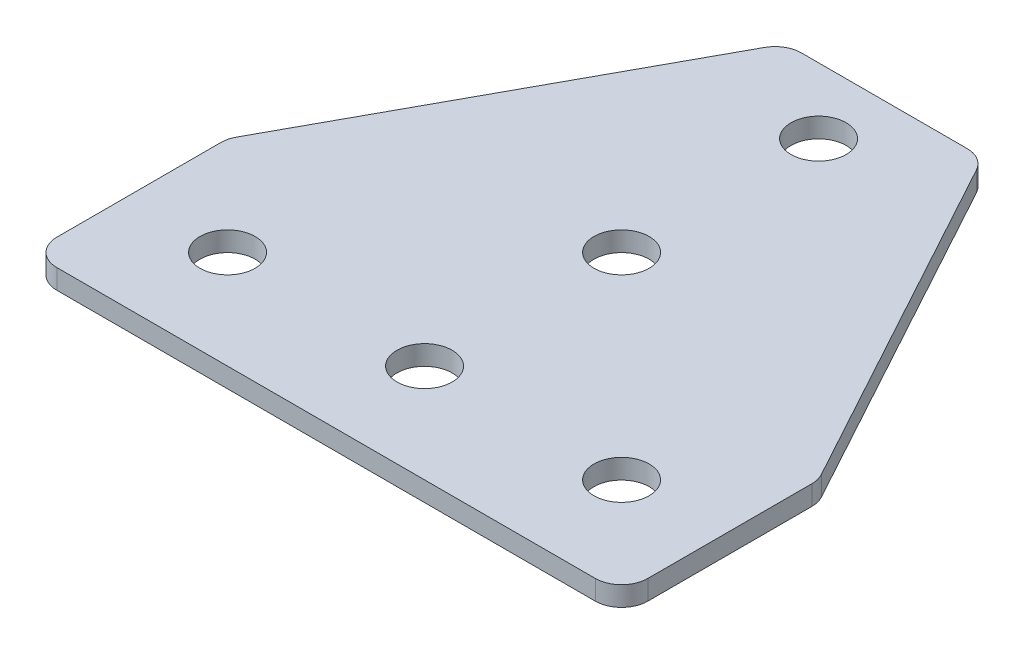
ISO-10303-21;
HEADER;
FILE_DESCRIPTION(('STEP AP214'),'2;1');
FILE_NAME('part.step','',(''),(''),'','','');
FILE_SCHEMA(('AUTOMOTIVE_DESIGN { 1 0 10303 214 1 1 1 1 }'));
ENDSEC;
DATA;
#1=APPLICATION_CONTEXT('core data for automotive mechanical design processes');
#2=APPLICATION_PROTOCOL_DEFINITION('international standard','automotive_design',2000,#1);
#3=PRODUCT_CONTEXT('',#1,'mechanical');
#4=PRODUCT('Part','Part','',(#3));
#5=PRODUCT_RELATED_PRODUCT_CATEGORY('part','',(#4));
#6=PRODUCT_DEFINITION_FORMATION('','',#4);
#7=PRODUCT_DEFINITION_CONTEXT('part definition',#1,'design');
#8=PRODUCT_DEFINITION('design','',#6,#7);
#9=PRODUCT_DEFINITION_SHAPE('','',#8);
#10=(LENGTH_UNIT() NAMED_UNIT(*) SI_UNIT(.MILLI.,.METRE.));
#11=(NAMED_UNIT(*) PLANE_ANGLE_UNIT() SI_UNIT($,.RADIAN.));
#12=(NAMED_UNIT(*) SI_UNIT($,.STERADIAN.) SOLID_ANGLE_UNIT());
#13=UNCERTAINTY_MEASURE_WITH_UNIT(LENGTH_MEASURE(1.E-05),#10,'distance_accuracy_value','');
#14=(GEOMETRIC_REPRESENTATION_CONTEXT(3) GLOBAL_UNCERTAINTY_ASSIGNED_CONTEXT((#13)) GLOBAL_UNIT_ASSIGNED_CONTEXT((#10,
#11,#12)) REPRESENTATION_CONTEXT('',''));
#15=CARTESIAN_POINT('',(0.,0.,0.));
#16=DIRECTION('',(0.,0.,1.));
#17=DIRECTION('',(1.,0.,0.));
#18=AXIS2_PLACEMENT_3D('',#15,#16,#17);
#19=CARTESIAN_POINT('',(0.,1.5,0.));
#20=DIRECTION('',(0.,1.,0.));
#21=DIRECTION('',(0.,0.,1.));
#22=AXIS2_PLACEMENT_3D('',#19,#20,#21);
#23=PLANE('',#22);
#24=CARTESIAN_POINT('',(22.5,1.5,-37.5));
#25=DIRECTION('',(0.,1.,0.));
#26=DIRECTION('',(0.,0.,1.));
#27=AXIS2_PLACEMENT_3D('',#24,#25,#26);
#28=CIRCLE('',#27,2.1);
#29=CARTESIAN_POINT('',(22.5,1.5,-35.4));
#30=VERTEX_POINT('',#29);
#31=EDGE_CURVE('E498',#30,#30,#28,.T.);
#32=ORIENTED_EDGE('',*,*,#31,.F.);
#33=EDGE_LOOP('',(#32));
#34=FACE_BOUND('',#33,.T.);
#35=CARTESIAN_POINT('',(37.5,1.5,-7.5));
#36=DIRECTION('',(0.,1.,0.));
#37=DIRECTION('',(0.,0.,-1.));
#38=AXIS2_PLACEMENT_3D('',#35,#36,#37);
#39=CIRCLE('',#38,2.1);
#40=CARTESIAN_POINT('',(37.5,1.5,-9.6));
#41=VERTEX_POINT('',#40);
#42=EDGE_CURVE('E210',#41,#41,#39,.T.);
#43=ORIENTED_EDGE('',*,*,#42,.F.);
#44=EDGE_LOOP('',(#43));
#45=FACE_BOUND('',#44,.T.);
#46=DIRECTION('',(-0.478852130680573,0.,0.877895572914384));
#47=VECTOR('',#46,1.);
#48=CARTESIAN_POINT('',(15.,1.5,-42.5));
#49=LINE('',#48,#47);
#50=CARTESIAN_POINT('',(14.4314750516515,1.5,-41.4577042613612));
#51=VERTEX_POINT('',#50);
#52=CARTESIAN_POINT('',(0.244208854171231,1.5,-15.4477162326473));
#53=VERTEX_POINT('',#52);
#54=EDGE_CURVE('E167',#51,#53,#49,.T.);
#55=ORIENTED_EDGE('',*,*,#54,.T.);
#56=CARTESIAN_POINT('',(2.,1.5,-14.4900119712861));
#57=DIRECTION('',(0.,1.,0.));
#58=DIRECTION('',(0.,0.,1.));
#59=AXIS2_PLACEMENT_3D('',#56,#57,#58);
#60=CIRCLE('',#59,2.);
#61=CARTESIAN_POINT('',(0.,1.5,-14.4900119712861));
#62=VERTEX_POINT('',#61);
#63=EDGE_CURVE('E229',#53,#62,#60,.T.);
#64=ORIENTED_EDGE('',*,*,#63,.T.);
#65=DIRECTION('',(0.,0.,1.));
#66=VECTOR('',#65,1.);
#67=CARTESIAN_POINT('',(0.,1.5,-15.));
#68=LINE('',#67,#66);
#69=CARTESIAN_POINT('',(0.,1.5,-2.));
#70=VERTEX_POINT('',#69);
#71=EDGE_CURVE('E149',#62,#70,#68,.T.);
#72=ORIENTED_EDGE('',*,*,#71,.T.);
#73=CARTESIAN_POINT('',(2.,1.5,-2.));
#74=DIRECTION('',(0.,1.,0.));
#75=DIRECTION('',(0.,0.,1.));
#76=AXIS2_PLACEMENT_3D('',#73,#74,#75);
#77=CIRCLE('',#76,2.);
#78=CARTESIAN_POINT('',(2.,1.5,0.));
#79=VERTEX_POINT('',#78);
#80=EDGE_CURVE('E225',#70,#79,#77,.T.);
#81=ORIENTED_EDGE('',*,*,#80,.T.);
#82=DIRECTION('',(1.,0.,0.));
#83=VECTOR('',#82,1.);
#84=CARTESIAN_POINT('',(0.,1.5,0.));
#85=LINE('',#84,#83);
#86=CARTESIAN_POINT('',(43.,1.5,0.));
#87=VERTEX_POINT('',#86);
#88=EDGE_CURVE('E214',#79,#87,#85,.T.);
#89=ORIENTED_EDGE('',*,*,#88,.T.);
#90=CARTESIAN_POINT('',(43.,1.5,-2.));
#91=DIRECTION('',(0.,1.,0.));
#92=DIRECTION('',(0.,0.,1.));
#93=AXIS2_PLACEMENT_3D('',#90,#91,#92);
#94=CIRCLE('',#93,2.);
#95=CARTESIAN_POINT('',(45.,1.5,-2.));
#96=VERTEX_POINT('',#95);
#97=EDGE_CURVE('E230',#87,#96,#94,.T.);
#98=ORIENTED_EDGE('',*,*,#97,.T.);
#99=DIRECTION('',(0.,0.,-1.));
#100=VECTOR('',#99,1.);
#101=CARTESIAN_POINT('',(45.,1.5,0.));
#102=LINE('',#101,#100);
#103=CARTESIAN_POINT('',(45.,1.5,-14.4900119712861));
#104=VERTEX_POINT('',#103);
#105=EDGE_CURVE('E271',#96,#104,#102,.T.);
#106=ORIENTED_EDGE('',*,*,#105,.T.);
#107=CARTESIAN_POINT('',(43.,1.5,-14.4900119712861));
#108=DIRECTION('',(0.,1.,0.));
#109=DIRECTION('',(0.,0.,1.));
#110=AXIS2_PLACEMENT_3D('',#107,#108,#109);
#111=CIRCLE('',#110,2.);
#112=CARTESIAN_POINT('',(44.7557911458288,1.5,-15.4477162326473));
#113=VERTEX_POINT('',#112);
#114=EDGE_CURVE('E279',#104,#113,#111,.T.);
#115=ORIENTED_EDGE('',*,*,#114,.T.);
#116=DIRECTION('',(-0.478852130680573,0.,-0.877895572914384));
#117=VECTOR('',#116,1.);
#118=CARTESIAN_POINT('',(45.,1.5,-15.));
#119=LINE('',#118,#117);
#120=CARTESIAN_POINT('',(30.5685249483485,1.5,-41.4577042613611));
#121=VERTEX_POINT('',#120);
#122=EDGE_CURVE('E255',#113,#121,#119,.T.);
#123=ORIENTED_EDGE('',*,*,#122,.T.);
#124=CARTESIAN_POINT('',(28.8127338025197,1.5,-40.5));
#125=DIRECTION('',(0.,1.,0.));
#126=DIRECTION('',(0.,0.,1.));
#127=AXIS2_PLACEMENT_3D('',#124,#125,#126);
#128=CIRCLE('',#127,2.);
#129=CARTESIAN_POINT('',(28.8127338025197,1.5,-42.5));
#130=VERTEX_POINT('',#129);
#131=EDGE_CURVE('E60',#121,#130,#128,.T.);
#132=ORIENTED_EDGE('',*,*,#131,.T.);
#133=DIRECTION('',(-1.,0.,0.));
#134=VECTOR('',#133,1.);
#135=CARTESIAN_POINT('',(30.,1.5,-42.5));
#136=LINE('',#135,#134);
#137=CARTESIAN_POINT('',(16.1872661974803,1.5,-42.5));
#138=VERTEX_POINT('',#137);
#139=EDGE_CURVE('E264',#130,#138,#136,.T.);
#140=ORIENTED_EDGE('',*,*,#139,.T.);
#141=CARTESIAN_POINT('',(16.1872661974803,1.5,-40.5));
#142=DIRECTION('',(0.,1.,0.));
#143=DIRECTION('',(0.,0.,1.));
#144=AXIS2_PLACEMENT_3D('',#141,#142,#143);
#145=CIRCLE('',#144,2.);
#146=EDGE_CURVE('E192',#138,#51,#145,.T.);
#147=ORIENTED_EDGE('',*,*,#146,.T.);
#148=EDGE_LOOP('',(#55,#64,#72,#81,#89,#98,#106,#115,#123,#132,#140,#147));
#149=FACE_BOUND('',#148,.T.);
#150=CARTESIAN_POINT('',(7.5,1.5,-7.5));
#151=DIRECTION('',(0.,1.,0.));
#152=DIRECTION('',(0.,0.,1.));
#153=AXIS2_PLACEMENT_3D('',#150,#151,#152);
#154=CIRCLE('',#153,2.1);
#155=CARTESIAN_POINT('',(7.5,1.5,-5.4));
#156=VERTEX_POINT('',#155);
#157=EDGE_CURVE('E157',#156,#156,#154,.T.);
#158=ORIENTED_EDGE('',*,*,#157,.F.);
#159=EDGE_LOOP('',(#158));
#160=FACE_BOUND('',#159,.T.);
#161=CARTESIAN_POINT('',(22.5,1.5,-7.5));
#162=DIRECTION('',(0.,1.,0.));
#163=DIRECTION('',(0.,0.,1.));
#164=AXIS2_PLACEMENT_3D('',#161,#162,#163);
#165=CIRCLE('',#164,2.1);
#166=CARTESIAN_POINT('',(22.5,1.5,-5.4));
#167=VERTEX_POINT('',#166);
#168=EDGE_CURVE('E509',#167,#167,#165,.T.);
#169=ORIENTED_EDGE('',*,*,#168,.F.);
#170=EDGE_LOOP('',(#169));
#171=FACE_BOUND('',#170,.T.);
#172=CARTESIAN_POINT('',(22.5,1.5,-22.5));
#173=DIRECTION('',(0.,1.,0.));
#174=DIRECTION('',(0.,0.,1.));
#175=AXIS2_PLACEMENT_3D('',#172,#173,#174);
#176=CIRCLE('',#175,2.1);
#177=CARTESIAN_POINT('',(22.5,1.5,-20.4));
#178=VERTEX_POINT('',#177);
#179=EDGE_CURVE('E492',#178,#178,#176,.T.);
#180=ORIENTED_EDGE('',*,*,#179,.F.);
#181=EDGE_LOOP('',(#180));
#182=FACE_BOUND('',#181,.T.);
#183=ADVANCED_FACE('F39',(#34,#45,#149,#160,#171,#182),#23,.T.);
#184=CARTESIAN_POINT('',(0.,0.,0.));
#185=DIRECTION('',(0.,1.,0.));
#186=DIRECTION('',(0.,0.,1.));
#187=AXIS2_PLACEMENT_3D('',#184,#185,#186);
#188=PLANE('',#187);
#189=DIRECTION('',(0.,0.,1.));
#190=VECTOR('',#189,1.);
#191=CARTESIAN_POINT('',(0.,0.,-15.));
#192=LINE('',#191,#190);
#193=CARTESIAN_POINT('',(0.,0.,-14.4900119712861));
#194=VERTEX_POINT('',#193);
#195=CARTESIAN_POINT('',(0.,0.,-2.));
#196=VERTEX_POINT('',#195);
#197=EDGE_CURVE('E146',#194,#196,#192,.T.);
#198=ORIENTED_EDGE('',*,*,#197,.F.);
#199=CARTESIAN_POINT('',(2.,0.,-14.4900119712861));
#200=DIRECTION('',(0.,1.,0.));
#201=DIRECTION('',(0.,0.,1.));
#202=AXIS2_PLACEMENT_3D('',#199,#200,#201);
#203=CIRCLE('',#202,2.);
#204=CARTESIAN_POINT('',(0.244208854171231,0.,-15.4477162326473));
#205=VERTEX_POINT('',#204);
#206=EDGE_CURVE('E129',#194,#205,#203,.F.);
#207=ORIENTED_EDGE('',*,*,#206,.T.);
#208=DIRECTION('',(-0.478852130680573,0.,0.877895572914384));
#209=VECTOR('',#208,1.);
#210=CARTESIAN_POINT('',(15.,0.,-42.5));
#211=LINE('',#210,#209);
#212=CARTESIAN_POINT('',(14.4314750516515,0.,-41.4577042613612));
#213=VERTEX_POINT('',#212);
#214=EDGE_CURVE('E178',#213,#205,#211,.T.);
#215=ORIENTED_EDGE('',*,*,#214,.F.);
#216=CARTESIAN_POINT('',(16.1872661974803,0.,-40.5));
#217=DIRECTION('',(0.,1.,0.));
#218=DIRECTION('',(0.,0.,1.));
#219=AXIS2_PLACEMENT_3D('',#216,#217,#218);
#220=CIRCLE('',#219,2.);
#221=CARTESIAN_POINT('',(16.1872661974803,0.,-42.5));
#222=VERTEX_POINT('',#221);
#223=EDGE_CURVE('E150',#213,#222,#220,.F.);
#224=ORIENTED_EDGE('',*,*,#223,.T.);
#225=DIRECTION('',(-1.,0.,0.));
#226=VECTOR('',#225,1.);
#227=CARTESIAN_POINT('',(30.,0.,-42.5));
#228=LINE('',#227,#226);
#229=CARTESIAN_POINT('',(28.8127338025197,0.,-42.5));
#230=VERTEX_POINT('',#229);
#231=EDGE_CURVE('E176',#230,#222,#228,.T.);
#232=ORIENTED_EDGE('',*,*,#231,.F.);
#233=CARTESIAN_POINT('',(28.8127338025197,0.,-40.5));
#234=DIRECTION('',(0.,1.,0.));
#235=DIRECTION('',(0.,0.,1.));
#236=AXIS2_PLACEMENT_3D('',#233,#234,#235);
#237=CIRCLE('',#236,2.);
#238=CARTESIAN_POINT('',(30.5685249483485,0.,-41.4577042613611));
#239=VERTEX_POINT('',#238);
#240=EDGE_CURVE('E182',#230,#239,#237,.F.);
#241=ORIENTED_EDGE('',*,*,#240,.T.);
#242=DIRECTION('',(-0.478852130680573,0.,-0.877895572914384));
#243=VECTOR('',#242,1.);
#244=CARTESIAN_POINT('',(45.,0.,-15.));
#245=LINE('',#244,#243);
#246=CARTESIAN_POINT('',(44.7557911458288,0.,-15.4477162326473));
#247=VERTEX_POINT('',#246);
#248=EDGE_CURVE('E173',#247,#239,#245,.T.);
#249=ORIENTED_EDGE('',*,*,#248,.F.);
#250=CARTESIAN_POINT('',(43.,0.,-14.4900119712861));
#251=DIRECTION('',(0.,1.,0.));
#252=DIRECTION('',(0.,0.,1.));
#253=AXIS2_PLACEMENT_3D('',#250,#251,#252);
#254=CIRCLE('',#253,2.);
#255=CARTESIAN_POINT('',(45.,0.,-14.4900119712861));
#256=VERTEX_POINT('',#255);
#257=EDGE_CURVE('E184',#247,#256,#254,.F.);
#258=ORIENTED_EDGE('',*,*,#257,.T.);
#259=DIRECTION('',(0.,0.,-1.));
#260=VECTOR('',#259,1.);
#261=CARTESIAN_POINT('',(45.,0.,0.));
#262=LINE('',#261,#260);
#263=CARTESIAN_POINT('',(45.,0.,-2.));
#264=VERTEX_POINT('',#263);
#265=EDGE_CURVE('E160',#264,#256,#262,.T.);
#266=ORIENTED_EDGE('',*,*,#265,.F.);
#267=CARTESIAN_POINT('',(43.,0.,-2.));
#268=DIRECTION('',(0.,1.,0.));
#269=DIRECTION('',(0.,0.,1.));
#270=AXIS2_PLACEMENT_3D('',#267,#268,#269);
#271=CIRCLE('',#270,2.);
#272=CARTESIAN_POINT('',(43.,0.,0.));
#273=VERTEX_POINT('',#272);
#274=EDGE_CURVE('E186',#264,#273,#271,.F.);
#275=ORIENTED_EDGE('',*,*,#274,.T.);
#276=DIRECTION('',(1.,0.,0.));
#277=VECTOR('',#276,1.);
#278=CARTESIAN_POINT('',(0.,0.,0.));
#279=LINE('',#278,#277);
#280=CARTESIAN_POINT('',(2.,0.,0.));
#281=VERTEX_POINT('',#280);
#282=EDGE_CURVE('E156',#281,#273,#279,.T.);
#283=ORIENTED_EDGE('',*,*,#282,.F.);
#284=CARTESIAN_POINT('',(2.,0.,-2.));
#285=DIRECTION('',(0.,1.,0.));
#286=DIRECTION('',(0.,0.,1.));
#287=AXIS2_PLACEMENT_3D('',#284,#285,#286);
#288=CIRCLE('',#287,2.);
#289=EDGE_CURVE('E140',#281,#196,#288,.F.);
#290=ORIENTED_EDGE('',*,*,#289,.T.);
#291=EDGE_LOOP('',(#198,#207,#215,#224,#232,#241,#249,#258,#266,#275,#283,#290));
#292=FACE_BOUND('',#291,.T.);
#293=CARTESIAN_POINT('',(7.5,0.,-7.5));
#294=DIRECTION('',(0.,1.,0.));
#295=DIRECTION('',(0.,0.,1.));
#296=AXIS2_PLACEMENT_3D('',#293,#294,#295);
#297=CIRCLE('',#296,2.1);
#298=CARTESIAN_POINT('',(7.5,0.,-5.4));
#299=VERTEX_POINT('',#298);
#300=EDGE_CURVE('E164',#299,#299,#297,.T.);
#301=ORIENTED_EDGE('',*,*,#300,.T.);
#302=EDGE_LOOP('',(#301));
#303=FACE_BOUND('',#302,.T.);
#304=CARTESIAN_POINT('',(37.5,0.,-7.5));
#305=DIRECTION('',(0.,1.,0.));
#306=DIRECTION('',(0.,0.,-1.));
#307=AXIS2_PLACEMENT_3D('',#304,#305,#306);
#308=CIRCLE('',#307,2.1);
#309=CARTESIAN_POINT('',(37.5,0.,-9.6));
#310=VERTEX_POINT('',#309);
#311=EDGE_CURVE('E206',#310,#310,#308,.T.);
#312=ORIENTED_EDGE('',*,*,#311,.T.);
#313=EDGE_LOOP('',(#312));
#314=FACE_BOUND('',#313,.T.);
#315=CARTESIAN_POINT('',(22.5,0.,-7.5));
#316=DIRECTION('',(0.,1.,0.));
#317=DIRECTION('',(0.,0.,1.));
#318=AXIS2_PLACEMENT_3D('',#315,#316,#317);
#319=CIRCLE('',#318,2.1);
#320=CARTESIAN_POINT('',(22.5,0.,-5.4));
#321=VERTEX_POINT('',#320);
#322=EDGE_CURVE('E483',#321,#321,#319,.T.);
#323=ORIENTED_EDGE('',*,*,#322,.T.);
#324=EDGE_LOOP('',(#323));
#325=FACE_BOUND('',#324,.T.);
#326=CARTESIAN_POINT('',(22.5,0.,-37.5));
#327=DIRECTION('',(0.,1.,0.));
#328=DIRECTION('',(0.,0.,1.));
#329=AXIS2_PLACEMENT_3D('',#326,#327,#328);
#330=CIRCLE('',#329,2.1);
#331=CARTESIAN_POINT('',(22.5,0.,-35.4));
#332=VERTEX_POINT('',#331);
#333=EDGE_CURVE('E487',#332,#332,#330,.T.);
#334=ORIENTED_EDGE('',*,*,#333,.T.);
#335=EDGE_LOOP('',(#334));
#336=FACE_BOUND('',#335,.T.);
#337=CARTESIAN_POINT('',(22.5,0.,-22.5));
#338=DIRECTION('',(0.,1.,0.));
#339=DIRECTION('',(0.,0.,1.));
#340=AXIS2_PLACEMENT_3D('',#337,#338,#339);
#341=CIRCLE('',#340,2.1);
#342=CARTESIAN_POINT('',(22.5,0.,-20.4));
#343=VERTEX_POINT('',#342);
#344=EDGE_CURVE('E490',#343,#343,#341,.T.);
#345=ORIENTED_EDGE('',*,*,#344,.T.);
#346=EDGE_LOOP('',(#345));
#347=FACE_BOUND('',#346,.T.);
#348=ADVANCED_FACE('F153',(#292,#303,#314,#325,#336,#347),#188,.F.);
#349=CARTESIAN_POINT('',(0.,1.5,-15.));
#350=DIRECTION('',(1.,0.,0.));
#351=DIRECTION('',(0.,0.,-1.));
#352=AXIS2_PLACEMENT_3D('',#349,#350,#351);
#353=PLANE('',#352);
#354=ORIENTED_EDGE('',*,*,#71,.F.);
#355=DIRECTION('',(0.,-1.,0.));
#356=VECTOR('',#355,1.);
#357=CARTESIAN_POINT('',(0.,1.5,-14.4900119712861));
#358=LINE('',#357,#356);
#359=EDGE_CURVE('E133',#62,#194,#358,.T.);
#360=ORIENTED_EDGE('',*,*,#359,.T.);
#361=ORIENTED_EDGE('',*,*,#197,.T.);
#362=DIRECTION('',(0.,-1.,0.));
#363=VECTOR('',#362,1.);
#364=CARTESIAN_POINT('',(0.,1.5,-2.));
#365=LINE('',#364,#363);
#366=EDGE_CURVE('E151',#196,#70,#365,.F.);
#367=ORIENTED_EDGE('',*,*,#366,.T.);
#368=EDGE_LOOP('',(#354,#360,#361,#367));
#369=FACE_BOUND('',#368,.T.);
#370=ADVANCED_FACE('F145',(#369),#353,.F.);
#371=CARTESIAN_POINT('',(0.,1.5,0.));
#372=DIRECTION('',(0.,0.,-1.));
#373=DIRECTION('',(-1.,0.,0.));
#374=AXIS2_PLACEMENT_3D('',#371,#372,#373);
#375=PLANE('',#374);
#376=ORIENTED_EDGE('',*,*,#88,.F.);
#377=DIRECTION('',(0.,-1.,0.));
#378=VECTOR('',#377,1.);
#379=CARTESIAN_POINT('',(2.,1.5,0.));
#380=LINE('',#379,#378);
#381=EDGE_CURVE('E237',#79,#281,#380,.T.);
#382=ORIENTED_EDGE('',*,*,#381,.T.);
#383=ORIENTED_EDGE('',*,*,#282,.T.);
#384=DIRECTION('',(0.,-1.,0.));
#385=VECTOR('',#384,1.);
#386=CARTESIAN_POINT('',(43.,1.5,0.));
#387=LINE('',#386,#385);
#388=EDGE_CURVE('E235',#273,#87,#387,.F.);
#389=ORIENTED_EDGE('',*,*,#388,.T.);
#390=EDGE_LOOP('',(#376,#382,#383,#389));
#391=FACE_BOUND('',#390,.T.);
#392=ADVANCED_FACE('F299',(#391),#375,.F.);
#393=CARTESIAN_POINT('',(45.,1.5,0.));
#394=DIRECTION('',(-1.,0.,0.));
#395=DIRECTION('',(0.,0.,1.));
#396=AXIS2_PLACEMENT_3D('',#393,#394,#395);
#397=PLANE('',#396);
#398=ORIENTED_EDGE('',*,*,#105,.F.);
#399=DIRECTION('',(0.,-1.,0.));
#400=VECTOR('',#399,1.);
#401=CARTESIAN_POINT('',(45.,1.5,-2.));
#402=LINE('',#401,#400);
#403=EDGE_CURVE('E242',#96,#264,#402,.T.);
#404=ORIENTED_EDGE('',*,*,#403,.T.);
#405=ORIENTED_EDGE('',*,*,#265,.T.);
#406=DIRECTION('',(0.,-1.,0.));
#407=VECTOR('',#406,1.);
#408=CARTESIAN_POINT('',(45.,1.5,-14.4900119712861));
#409=LINE('',#408,#407);
#410=EDGE_CURVE('E240',#256,#104,#409,.F.);
#411=ORIENTED_EDGE('',*,*,#410,.T.);
#412=EDGE_LOOP('',(#398,#404,#405,#411));
#413=FACE_BOUND('',#412,.T.);
#414=ADVANCED_FACE('F295',(#413),#397,.F.);
#415=CARTESIAN_POINT('',(45.,1.5,-15.));
#416=DIRECTION('',(-0.877895572914384,0.,0.478852130680573));
#417=DIRECTION('',(0.478852130680573,0.,0.877895572914385));
#418=AXIS2_PLACEMENT_3D('',#415,#416,#417);
#419=PLANE('',#418);
#420=ORIENTED_EDGE('',*,*,#122,.F.);
#421=DIRECTION('',(0.,-1.,0.));
#422=VECTOR('',#421,1.);
#423=CARTESIAN_POINT('',(44.7557911458288,1.5,-15.4477162326473));
#424=LINE('',#423,#422);
#425=EDGE_CURVE('E247',#113,#247,#424,.T.);
#426=ORIENTED_EDGE('',*,*,#425,.T.);
#427=ORIENTED_EDGE('',*,*,#248,.T.);
#428=DIRECTION('',(0.,-1.,0.));
#429=VECTOR('',#428,1.);
#430=CARTESIAN_POINT('',(30.5685249483485,1.5,-41.4577042613612));
#431=LINE('',#430,#429);
#432=EDGE_CURVE('E245',#239,#121,#431,.F.);
#433=ORIENTED_EDGE('',*,*,#432,.T.);
#434=EDGE_LOOP('',(#420,#426,#427,#433));
#435=FACE_BOUND('',#434,.T.);
#436=ADVANCED_FACE('F253',(#435),#419,.F.);
#437=CARTESIAN_POINT('',(30.,1.5,-42.5));
#438=DIRECTION('',(0.,0.,1.));
#439=DIRECTION('',(1.,0.,0.));
#440=AXIS2_PLACEMENT_3D('',#437,#438,#439);
#441=PLANE('',#440);
#442=ORIENTED_EDGE('',*,*,#139,.F.);
#443=DIRECTION('',(0.,-1.,0.));
#444=VECTOR('',#443,1.);
#445=CARTESIAN_POINT('',(28.8127338025197,1.5,-42.5));
#446=LINE('',#445,#444);
#447=EDGE_CURVE('E12',#130,#230,#446,.T.);
#448=ORIENTED_EDGE('',*,*,#447,.T.);
#449=ORIENTED_EDGE('',*,*,#231,.T.);
#450=DIRECTION('',(0.,-1.,0.));
#451=VECTOR('',#450,1.);
#452=CARTESIAN_POINT('',(16.1872661974803,1.5,-42.5));
#453=LINE('',#452,#451);
#454=EDGE_CURVE('E47',#222,#138,#453,.F.);
#455=ORIENTED_EDGE('',*,*,#454,.T.);
#456=EDGE_LOOP('',(#442,#448,#449,#455));
#457=FACE_BOUND('',#456,.T.);
#458=ADVANCED_FACE('F263',(#457),#441,.F.);
#459=CARTESIAN_POINT('',(15.,1.5,-42.5));
#460=DIRECTION('',(0.877895572914384,0.,0.478852130680573));
#461=DIRECTION('',(0.478852130680573,0.,-0.877895572914384));
#462=AXIS2_PLACEMENT_3D('',#459,#460,#461);
#463=PLANE('',#462);
#464=ORIENTED_EDGE('',*,*,#214,.T.);
#465=DIRECTION('',(0.,-1.,0.));
#466=VECTOR('',#465,1.);
#467=CARTESIAN_POINT('',(0.244208854171228,1.5,-15.4477162326473));
#468=LINE('',#467,#466);
#469=EDGE_CURVE('E134',#205,#53,#468,.F.);
#470=ORIENTED_EDGE('',*,*,#469,.T.);
#471=ORIENTED_EDGE('',*,*,#54,.F.);
#472=DIRECTION('',(0.,-1.,0.));
#473=VECTOR('',#472,1.);
#474=CARTESIAN_POINT('',(14.4314750516515,1.5,-41.4577042613612));
#475=LINE('',#474,#473);
#476=EDGE_CURVE('E139',#51,#213,#475,.T.);
#477=ORIENTED_EDGE('',*,*,#476,.T.);
#478=EDGE_LOOP('',(#464,#470,#471,#477));
#479=FACE_BOUND('',#478,.T.);
#480=ADVANCED_FACE('F307',(#479),#463,.F.);
#481=CARTESIAN_POINT('',(7.5,1.5,-7.5));
#482=DIRECTION('',(0.,-1.,0.));
#483=DIRECTION('',(0.,0.,-1.));
#484=AXIS2_PLACEMENT_3D('',#481,#482,#483);
#485=CYLINDRICAL_SURFACE('',#484,2.1);
#486=ORIENTED_EDGE('',*,*,#157,.T.);
#487=EDGE_LOOP('',(#486));
#488=FACE_BOUND('',#487,.T.);
#489=ORIENTED_EDGE('',*,*,#300,.F.);
#490=EDGE_LOOP('',(#489));
#491=FACE_BOUND('',#490,.T.);
#492=ADVANCED_FACE('F324',(#488,#491),#485,.F.);
#493=CARTESIAN_POINT('',(37.5,1.5,-7.5));
#494=DIRECTION('',(0.,-1.,0.));
#495=DIRECTION('',(0.,0.,-1.));
#496=AXIS2_PLACEMENT_3D('',#493,#494,#495);
#497=CYLINDRICAL_SURFACE('',#496,2.1);
#498=ORIENTED_EDGE('',*,*,#42,.T.);
#499=EDGE_LOOP('',(#498));
#500=FACE_BOUND('',#499,.T.);
#501=ORIENTED_EDGE('',*,*,#311,.F.);
#502=EDGE_LOOP('',(#501));
#503=FACE_BOUND('',#502,.T.);
#504=ADVANCED_FACE('F404',(#500,#503),#497,.F.);
#505=CARTESIAN_POINT('',(22.5,1.5,-7.5));
#506=DIRECTION('',(0.,-1.,0.));
#507=DIRECTION('',(0.,0.,-1.));
#508=AXIS2_PLACEMENT_3D('',#505,#506,#507);
#509=CYLINDRICAL_SURFACE('',#508,2.1);
#510=ORIENTED_EDGE('',*,*,#168,.T.);
#511=EDGE_LOOP('',(#510));
#512=FACE_BOUND('',#511,.T.);
#513=ORIENTED_EDGE('',*,*,#322,.F.);
#514=EDGE_LOOP('',(#513));
#515=FACE_BOUND('',#514,.T.);
#516=ADVANCED_FACE('F395',(#512,#515),#509,.F.);
#517=CARTESIAN_POINT('',(22.5,1.5,-37.5));
#518=DIRECTION('',(0.,-1.,0.));
#519=DIRECTION('',(0.,0.,-1.));
#520=AXIS2_PLACEMENT_3D('',#517,#518,#519);
#521=CYLINDRICAL_SURFACE('',#520,2.1);
#522=ORIENTED_EDGE('',*,*,#31,.T.);
#523=EDGE_LOOP('',(#522));
#524=FACE_BOUND('',#523,.T.);
#525=ORIENTED_EDGE('',*,*,#333,.F.);
#526=EDGE_LOOP('',(#525));
#527=FACE_BOUND('',#526,.T.);
#528=ADVANCED_FACE('F386',(#524,#527),#521,.F.);
#529=CARTESIAN_POINT('',(22.5,1.5,-22.5));
#530=DIRECTION('',(0.,-1.,0.));
#531=DIRECTION('',(0.,0.,-1.));
#532=AXIS2_PLACEMENT_3D('',#529,#530,#531);
#533=CYLINDRICAL_SURFACE('',#532,2.1);
#534=ORIENTED_EDGE('',*,*,#179,.T.);
#535=EDGE_LOOP('',(#534));
#536=FACE_BOUND('',#535,.T.);
#537=ORIENTED_EDGE('',*,*,#344,.F.);
#538=EDGE_LOOP('',(#537));
#539=FACE_BOUND('',#538,.T.);
#540=ADVANCED_FACE('F341',(#536,#539),#533,.F.);
#541=CARTESIAN_POINT('',(2.,1.5,-14.4900119712861));
#542=DIRECTION('',(0.,-1.,0.));
#543=DIRECTION('',(0.,0.,-1.));
#544=AXIS2_PLACEMENT_3D('',#541,#542,#543);
#545=CYLINDRICAL_SURFACE('',#544,2.);
#546=ORIENTED_EDGE('',*,*,#63,.F.);
#547=ORIENTED_EDGE('',*,*,#469,.F.);
#548=ORIENTED_EDGE('',*,*,#206,.F.);
#549=ORIENTED_EDGE('',*,*,#359,.F.);
#550=EDGE_LOOP('',(#546,#547,#548,#549));
#551=FACE_BOUND('',#550,.T.);
#552=ADVANCED_FACE('F132',(#551),#545,.T.);
#553=CARTESIAN_POINT('',(2.,1.5,-2.));
#554=DIRECTION('',(0.,-1.,0.));
#555=DIRECTION('',(0.,0.,-1.));
#556=AXIS2_PLACEMENT_3D('',#553,#554,#555);
#557=CYLINDRICAL_SURFACE('',#556,2.);
#558=ORIENTED_EDGE('',*,*,#80,.F.);
#559=ORIENTED_EDGE('',*,*,#366,.F.);
#560=ORIENTED_EDGE('',*,*,#289,.F.);
#561=ORIENTED_EDGE('',*,*,#381,.F.);
#562=EDGE_LOOP('',(#558,#559,#560,#561));
#563=FACE_BOUND('',#562,.T.);
#564=ADVANCED_FACE('F303',(#563),#557,.T.);
#565=CARTESIAN_POINT('',(43.,1.5,-2.));
#566=DIRECTION('',(0.,-1.,0.));
#567=DIRECTION('',(0.,0.,-1.));
#568=AXIS2_PLACEMENT_3D('',#565,#566,#567);
#569=CYLINDRICAL_SURFACE('',#568,2.);
#570=ORIENTED_EDGE('',*,*,#97,.F.);
#571=ORIENTED_EDGE('',*,*,#388,.F.);
#572=ORIENTED_EDGE('',*,*,#274,.F.);
#573=ORIENTED_EDGE('',*,*,#403,.F.);
#574=EDGE_LOOP('',(#570,#571,#572,#573));
#575=FACE_BOUND('',#574,.T.);
#576=ADVANCED_FACE('F297',(#575),#569,.T.);
#577=CARTESIAN_POINT('',(43.,1.5,-14.4900119712861));
#578=DIRECTION('',(0.,-1.,0.));
#579=DIRECTION('',(0.,0.,-1.));
#580=AXIS2_PLACEMENT_3D('',#577,#578,#579);
#581=CYLINDRICAL_SURFACE('',#580,2.);
#582=ORIENTED_EDGE('',*,*,#114,.F.);
#583=ORIENTED_EDGE('',*,*,#410,.F.);
#584=ORIENTED_EDGE('',*,*,#257,.F.);
#585=ORIENTED_EDGE('',*,*,#425,.F.);
#586=EDGE_LOOP('',(#582,#583,#584,#585));
#587=FACE_BOUND('',#586,.T.);
#588=ADVANCED_FACE('F313',(#587),#581,.T.);
#589=CARTESIAN_POINT('',(28.8127338025197,1.5,-40.5));
#590=DIRECTION('',(0.,-1.,0.));
#591=DIRECTION('',(0.,0.,-1.));
#592=AXIS2_PLACEMENT_3D('',#589,#590,#591);
#593=CYLINDRICAL_SURFACE('',#592,2.);
#594=ORIENTED_EDGE('',*,*,#131,.F.);
#595=ORIENTED_EDGE('',*,*,#432,.F.);
#596=ORIENTED_EDGE('',*,*,#240,.F.);
#597=ORIENTED_EDGE('',*,*,#447,.F.);
#598=EDGE_LOOP('',(#594,#595,#596,#597));
#599=FACE_BOUND('',#598,.T.);
#600=ADVANCED_FACE('F262',(#599),#593,.T.);
#601=CARTESIAN_POINT('',(16.1872661974803,1.5,-40.5));
#602=DIRECTION('',(0.,-1.,0.));
#603=DIRECTION('',(0.,0.,-1.));
#604=AXIS2_PLACEMENT_3D('',#601,#602,#603);
#605=CYLINDRICAL_SURFACE('',#604,2.);
#606=ORIENTED_EDGE('',*,*,#146,.F.);
#607=ORIENTED_EDGE('',*,*,#454,.F.);
#608=ORIENTED_EDGE('',*,*,#223,.F.);
#609=ORIENTED_EDGE('',*,*,#476,.F.);
#610=EDGE_LOOP('',(#606,#607,#608,#609));
#611=FACE_BOUND('',#610,.T.);
#612=ADVANCED_FACE('F41',(#611),#605,.T.);
#613=CLOSED_SHELL('',(#183,#348,#370,#392,#414,#436,#458,#480,#492,#504,#516,#528,#540,#552,
#564,#576,#588,#600,#612));
#614=MANIFOLD_SOLID_BREP('B2',#613);
#615=ADVANCED_BREP_SHAPE_REPRESENTATION('',(#18,#614),#14);
#616=SHAPE_DEFINITION_REPRESENTATION(#9,#615);
ENDSEC;
END-ISO-10303-21;
